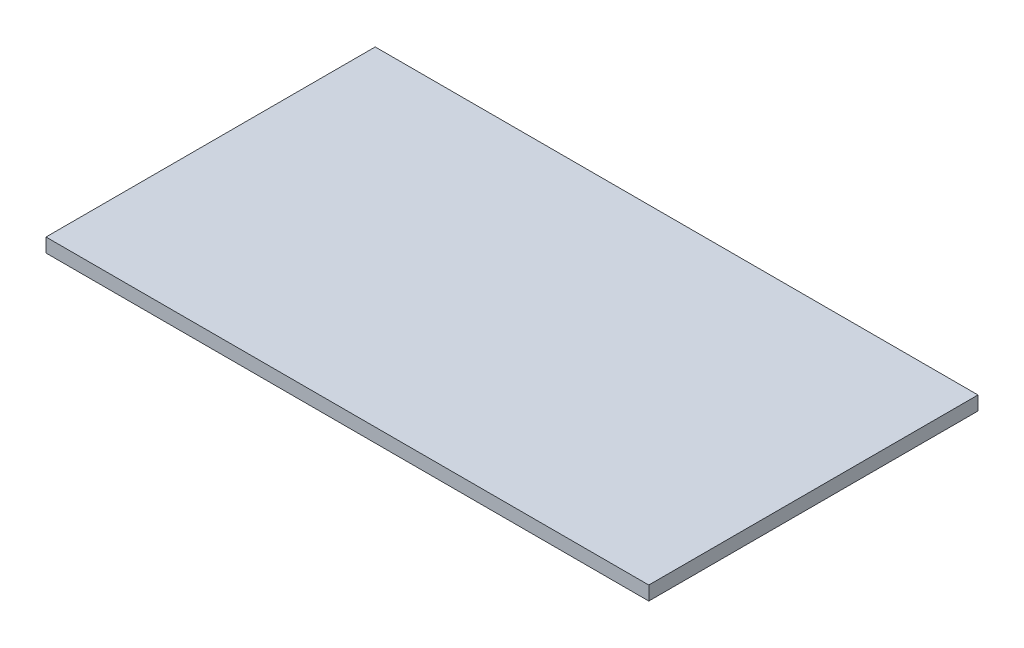
ISO-10303-21;
HEADER;
FILE_DESCRIPTION(('STEP AP214'),'2;1');
FILE_NAME('part.step','',(''),(''),'','','');
FILE_SCHEMA(('AUTOMOTIVE_DESIGN { 1 0 10303 214 1 1 1 1 }'));
ENDSEC;
DATA;
#1=APPLICATION_CONTEXT('core data for automotive mechanical design processes');
#2=APPLICATION_PROTOCOL_DEFINITION('international standard','automotive_design',2000,#1);
#3=PRODUCT_CONTEXT('',#1,'mechanical');
#4=PRODUCT('Part','Part','',(#3));
#5=PRODUCT_RELATED_PRODUCT_CATEGORY('part','',(#4));
#6=PRODUCT_DEFINITION_FORMATION('','',#4);
#7=PRODUCT_DEFINITION_CONTEXT('part definition',#1,'design');
#8=PRODUCT_DEFINITION('design','',#6,#7);
#9=PRODUCT_DEFINITION_SHAPE('','',#8);
#10=(LENGTH_UNIT() NAMED_UNIT(*) SI_UNIT(.MILLI.,.METRE.));
#11=(NAMED_UNIT(*) PLANE_ANGLE_UNIT() SI_UNIT($,.RADIAN.));
#12=(NAMED_UNIT(*) SI_UNIT($,.STERADIAN.) SOLID_ANGLE_UNIT());
#13=UNCERTAINTY_MEASURE_WITH_UNIT(LENGTH_MEASURE(1.E-05),#10,'distance_accuracy_value','');
#14=(GEOMETRIC_REPRESENTATION_CONTEXT(3) GLOBAL_UNCERTAINTY_ASSIGNED_CONTEXT((#13)) GLOBAL_UNIT_ASSIGNED_CONTEXT((#10,
#11,#12)) REPRESENTATION_CONTEXT('',''));
#15=CARTESIAN_POINT('',(0.,0.,0.));
#16=DIRECTION('',(0.,0.,1.));
#17=DIRECTION('',(1.,0.,0.));
#18=AXIS2_PLACEMENT_3D('',#15,#16,#17);
#19=CARTESIAN_POINT('',(0.,1.524,0.));
#20=DIRECTION('',(1.,0.,0.));
#21=DIRECTION('',(0.,0.,-1.));
#22=AXIS2_PLACEMENT_3D('',#19,#20,#21);
#23=PLANE('',#22);
#24=DIRECTION('',(0.,0.,1.));
#25=VECTOR('',#24,1.);
#26=CARTESIAN_POINT('',(0.,0.,0.));
#27=LINE('',#26,#25);
#28=CARTESIAN_POINT('',(0.,0.,-36.068));
#29=VERTEX_POINT('',#28);
#30=CARTESIAN_POINT('',(0.,0.,0.));
#31=VERTEX_POINT('',#30);
#32=EDGE_CURVE('E97',#29,#31,#27,.T.);
#33=ORIENTED_EDGE('',*,*,#32,.T.);
#34=DIRECTION('',(0.,-1.,0.));
#35=VECTOR('',#34,1.);
#36=CARTESIAN_POINT('',(0.,1.524,0.));
#37=LINE('',#36,#35);
#38=CARTESIAN_POINT('',(0.,1.524,0.));
#39=VERTEX_POINT('',#38);
#40=EDGE_CURVE('E11',#39,#31,#37,.T.);
#41=ORIENTED_EDGE('',*,*,#40,.F.);
#42=DIRECTION('',(0.,0.,1.));
#43=VECTOR('',#42,1.);
#44=CARTESIAN_POINT('',(0.,1.524,0.));
#45=LINE('',#44,#43);
#46=CARTESIAN_POINT('',(0.,1.524,-36.068));
#47=VERTEX_POINT('',#46);
#48=EDGE_CURVE('E85',#47,#39,#45,.T.);
#49=ORIENTED_EDGE('',*,*,#48,.F.);
#50=DIRECTION('',(0.,-1.,0.));
#51=VECTOR('',#50,1.);
#52=CARTESIAN_POINT('',(0.,1.524,-36.068));
#53=LINE('',#52,#51);
#54=EDGE_CURVE('E93',#47,#29,#53,.T.);
#55=ORIENTED_EDGE('',*,*,#54,.T.);
#56=EDGE_LOOP('',(#33,#41,#49,#55));
#57=FACE_BOUND('',#56,.T.);
#58=ADVANCED_FACE('F34',(#57),#23,.F.);
#59=CARTESIAN_POINT('',(0.,1.524,0.));
#60=DIRECTION('',(0.,0.,-1.));
#61=DIRECTION('',(-1.,0.,0.));
#62=AXIS2_PLACEMENT_3D('',#59,#60,#61);
#63=PLANE('',#62);
#64=DIRECTION('',(1.,0.,0.));
#65=VECTOR('',#64,1.);
#66=CARTESIAN_POINT('',(0.,0.,0.));
#67=LINE('',#66,#65);
#68=CARTESIAN_POINT('',(66.04,0.,0.));
#69=VERTEX_POINT('',#68);
#70=EDGE_CURVE('E89',#31,#69,#67,.T.);
#71=ORIENTED_EDGE('',*,*,#70,.T.);
#72=DIRECTION('',(0.,-1.,0.));
#73=VECTOR('',#72,1.);
#74=CARTESIAN_POINT('',(66.04,1.524,0.));
#75=LINE('',#74,#73);
#76=CARTESIAN_POINT('',(66.04,1.524,0.));
#77=VERTEX_POINT('',#76);
#78=EDGE_CURVE('E42',#77,#69,#75,.T.);
#79=ORIENTED_EDGE('',*,*,#78,.F.);
#80=DIRECTION('',(1.,0.,0.));
#81=VECTOR('',#80,1.);
#82=CARTESIAN_POINT('',(0.,1.524,0.));
#83=LINE('',#82,#81);
#84=EDGE_CURVE('E80',#39,#77,#83,.T.);
#85=ORIENTED_EDGE('',*,*,#84,.F.);
#86=ORIENTED_EDGE('',*,*,#40,.T.);
#87=EDGE_LOOP('',(#71,#79,#85,#86));
#88=FACE_BOUND('',#87,.T.);
#89=ADVANCED_FACE('F88',(#88),#63,.F.);
#90=CARTESIAN_POINT('',(66.04,1.524,0.));
#91=DIRECTION('',(-1.,0.,0.));
#92=DIRECTION('',(0.,0.,1.));
#93=AXIS2_PLACEMENT_3D('',#90,#91,#92);
#94=PLANE('',#93);
#95=DIRECTION('',(0.,0.,-1.));
#96=VECTOR('',#95,1.);
#97=CARTESIAN_POINT('',(66.04,0.,0.));
#98=LINE('',#97,#96);
#99=CARTESIAN_POINT('',(66.04,0.,-36.068));
#100=VERTEX_POINT('',#99);
#101=EDGE_CURVE('E67',#69,#100,#98,.T.);
#102=ORIENTED_EDGE('',*,*,#101,.T.);
#103=DIRECTION('',(0.,-1.,0.));
#104=VECTOR('',#103,1.);
#105=CARTESIAN_POINT('',(66.04,1.524,-36.068));
#106=LINE('',#105,#104);
#107=CARTESIAN_POINT('',(66.04,1.524,-36.068));
#108=VERTEX_POINT('',#107);
#109=EDGE_CURVE('E90',#108,#100,#106,.T.);
#110=ORIENTED_EDGE('',*,*,#109,.F.);
#111=DIRECTION('',(0.,0.,-1.));
#112=VECTOR('',#111,1.);
#113=CARTESIAN_POINT('',(66.04,1.524,0.));
#114=LINE('',#113,#112);
#115=EDGE_CURVE('E83',#77,#108,#114,.T.);
#116=ORIENTED_EDGE('',*,*,#115,.F.);
#117=ORIENTED_EDGE('',*,*,#78,.T.);
#118=EDGE_LOOP('',(#102,#110,#116,#117));
#119=FACE_BOUND('',#118,.T.);
#120=ADVANCED_FACE('F91',(#119),#94,.F.);
#121=CARTESIAN_POINT('',(0.,1.524,-36.068));
#122=DIRECTION('',(0.,0.,1.));
#123=DIRECTION('',(1.,0.,0.));
#124=AXIS2_PLACEMENT_3D('',#121,#122,#123);
#125=PLANE('',#124);
#126=DIRECTION('',(-1.,0.,0.));
#127=VECTOR('',#126,1.);
#128=CARTESIAN_POINT('',(0.,0.,-36.068));
#129=LINE('',#128,#127);
#130=EDGE_CURVE('E73',#100,#29,#129,.T.);
#131=ORIENTED_EDGE('',*,*,#130,.T.);
#132=ORIENTED_EDGE('',*,*,#54,.F.);
#133=DIRECTION('',(-1.,0.,0.));
#134=VECTOR('',#133,1.);
#135=CARTESIAN_POINT('',(0.,1.524,-36.068));
#136=LINE('',#135,#134);
#137=EDGE_CURVE('E50',#108,#47,#136,.T.);
#138=ORIENTED_EDGE('',*,*,#137,.F.);
#139=ORIENTED_EDGE('',*,*,#109,.T.);
#140=EDGE_LOOP('',(#131,#132,#138,#139));
#141=FACE_BOUND('',#140,.T.);
#142=ADVANCED_FACE('F104',(#141),#125,.F.);
#143=CARTESIAN_POINT('',(0.,1.524,0.));
#144=DIRECTION('',(0.,-1.,0.));
#145=DIRECTION('',(0.,0.,-1.));
#146=AXIS2_PLACEMENT_3D('',#143,#144,#145);
#147=PLANE('',#146);
#148=ORIENTED_EDGE('',*,*,#48,.T.);
#149=ORIENTED_EDGE('',*,*,#84,.T.);
#150=ORIENTED_EDGE('',*,*,#115,.T.);
#151=ORIENTED_EDGE('',*,*,#137,.T.);
#152=EDGE_LOOP('',(#148,#149,#150,#151));
#153=FACE_BOUND('',#152,.T.);
#154=ADVANCED_FACE('F81',(#153),#147,.F.);
#155=CARTESIAN_POINT('',(0.,0.,0.));
#156=DIRECTION('',(0.,-1.,0.));
#157=DIRECTION('',(0.,0.,-1.));
#158=AXIS2_PLACEMENT_3D('',#155,#156,#157);
#159=PLANE('',#158);
#160=ORIENTED_EDGE('',*,*,#32,.F.);
#161=ORIENTED_EDGE('',*,*,#130,.F.);
#162=ORIENTED_EDGE('',*,*,#101,.F.);
#163=ORIENTED_EDGE('',*,*,#70,.F.);
#164=EDGE_LOOP('',(#160,#161,#162,#163));
#165=FACE_BOUND('',#164,.T.);
#166=ADVANCED_FACE('F107',(#165),#159,.T.);
#167=CLOSED_SHELL('',(#58,#89,#120,#142,#154,#166));
#168=MANIFOLD_SOLID_BREP('B2',#167);
#169=ADVANCED_BREP_SHAPE_REPRESENTATION('',(#18,#168),#14);
#170=SHAPE_DEFINITION_REPRESENTATION(#9,#169);
ENDSEC;
END-ISO-10303-21;
